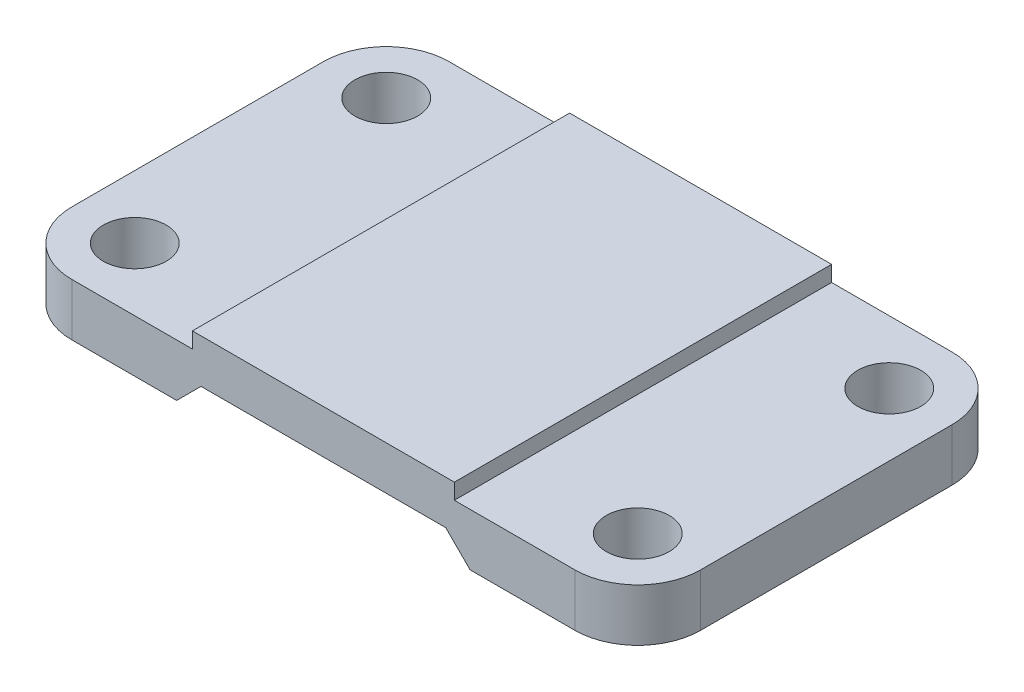
ISO-10303-21;
HEADER;
FILE_DESCRIPTION(('STEP AP214'),'2;1');
FILE_NAME('part.step','',(''),(''),'','','');
FILE_SCHEMA(('AUTOMOTIVE_DESIGN { 1 0 10303 214 1 1 1 1 }'));
ENDSEC;
DATA;
#1=APPLICATION_CONTEXT('core data for automotive mechanical design processes');
#2=APPLICATION_PROTOCOL_DEFINITION('international standard','automotive_design',2000,#1);
#3=PRODUCT_CONTEXT('',#1,'mechanical');
#4=PRODUCT('Part','Part','',(#3));
#5=PRODUCT_RELATED_PRODUCT_CATEGORY('part','',(#4));
#6=PRODUCT_DEFINITION_FORMATION('','',#4);
#7=PRODUCT_DEFINITION_CONTEXT('part definition',#1,'design');
#8=PRODUCT_DEFINITION('design','',#6,#7);
#9=PRODUCT_DEFINITION_SHAPE('','',#8);
#10=(LENGTH_UNIT() NAMED_UNIT(*) SI_UNIT(.MILLI.,.METRE.));
#11=(NAMED_UNIT(*) PLANE_ANGLE_UNIT() SI_UNIT($,.RADIAN.));
#12=(NAMED_UNIT(*) SI_UNIT($,.STERADIAN.) SOLID_ANGLE_UNIT());
#13=UNCERTAINTY_MEASURE_WITH_UNIT(LENGTH_MEASURE(1.E-05),#10,'distance_accuracy_value','');
#14=(GEOMETRIC_REPRESENTATION_CONTEXT(3) GLOBAL_UNCERTAINTY_ASSIGNED_CONTEXT((#13)) GLOBAL_UNIT_ASSIGNED_CONTEXT((#10,
#11,#12)) REPRESENTATION_CONTEXT('',''));
#15=CARTESIAN_POINT('',(0.,0.,0.));
#16=DIRECTION('',(0.,0.,1.));
#17=DIRECTION('',(1.,0.,0.));
#18=AXIS2_PLACEMENT_3D('',#15,#16,#17);
#19=CARTESIAN_POINT('',(32.,0.,72.));
#20=DIRECTION('',(0.,1.,0.));
#21=DIRECTION('',(-1.,0.,0.));
#22=AXIS2_PLACEMENT_3D('',#19,#20,#21);
#23=PLANE('',#22);
#24=CARTESIAN_POINT('',(12.,0.,60.));
#25=DIRECTION('',(0.,1.,0.));
#26=DIRECTION('',(-1.,0.,0.));
#27=AXIS2_PLACEMENT_3D('',#24,#25,#26);
#28=CIRCLE('',#27,6.);
#29=CARTESIAN_POINT('',(6.,0.,60.));
#30=VERTEX_POINT('',#29);
#31=EDGE_CURVE('E335',#30,#30,#28,.T.);
#32=ORIENTED_EDGE('',*,*,#31,.T.);
#33=EDGE_LOOP('',(#32));
#34=FACE_BOUND('',#33,.T.);
#35=CARTESIAN_POINT('',(12.,0.,12.));
#36=DIRECTION('',(0.,1.,0.));
#37=DIRECTION('',(-1.,0.,0.));
#38=AXIS2_PLACEMENT_3D('',#35,#36,#37);
#39=CIRCLE('',#38,6.);
#40=CARTESIAN_POINT('',(6.,0.,12.));
#41=VERTEX_POINT('',#40);
#42=EDGE_CURVE('E327',#41,#41,#39,.T.);
#43=ORIENTED_EDGE('',*,*,#42,.T.);
#44=EDGE_LOOP('',(#43));
#45=FACE_BOUND('',#44,.T.);
#46=CARTESIAN_POINT('',(12.,0.,12.));
#47=DIRECTION('',(0.,1.,0.));
#48=DIRECTION('',(-1.,0.,0.));
#49=AXIS2_PLACEMENT_3D('',#46,#47,#48);
#50=CIRCLE('',#49,12.);
#51=CARTESIAN_POINT('',(12.0000000000001,0.,0.));
#52=VERTEX_POINT('',#51);
#53=CARTESIAN_POINT('',(0.,0.,12.0000000000001));
#54=VERTEX_POINT('',#53);
#55=EDGE_CURVE('E325',#52,#54,#50,.T.);
#56=ORIENTED_EDGE('',*,*,#55,.F.);
#57=DIRECTION('',(1.,0.,0.));
#58=VECTOR('',#57,1.);
#59=CARTESIAN_POINT('',(32.,0.,0.));
#60=LINE('',#59,#58);
#61=CARTESIAN_POINT('',(32.,0.,0.));
#62=VERTEX_POINT('',#61);
#63=EDGE_CURVE('E279',#52,#62,#60,.T.);
#64=ORIENTED_EDGE('',*,*,#63,.T.);
#65=DIRECTION('',(0.,0.,-1.));
#66=VECTOR('',#65,1.);
#67=CARTESIAN_POINT('',(32.,0.,72.));
#68=LINE('',#67,#66);
#69=CARTESIAN_POINT('',(32.,0.,72.));
#70=VERTEX_POINT('',#69);
#71=EDGE_CURVE('E245',#70,#62,#68,.T.);
#72=ORIENTED_EDGE('',*,*,#71,.F.);
#73=DIRECTION('',(1.,0.,0.));
#74=VECTOR('',#73,1.);
#75=CARTESIAN_POINT('',(32.,0.,72.));
#76=LINE('',#75,#74);
#77=CARTESIAN_POINT('',(12.,0.,72.));
#78=VERTEX_POINT('',#77);
#79=EDGE_CURVE('E299',#78,#70,#76,.T.);
#80=ORIENTED_EDGE('',*,*,#79,.F.);
#81=CARTESIAN_POINT('',(12.,0.,60.));
#82=DIRECTION('',(0.,1.,0.));
#83=DIRECTION('',(-1.,0.,0.));
#84=AXIS2_PLACEMENT_3D('',#81,#82,#83);
#85=CIRCLE('',#84,12.);
#86=CARTESIAN_POINT('',(0.,0.,59.9999999999999));
#87=VERTEX_POINT('',#86);
#88=EDGE_CURVE('E102',#87,#78,#85,.T.);
#89=ORIENTED_EDGE('',*,*,#88,.F.);
#90=DIRECTION('',(0.,0.,-1.));
#91=VECTOR('',#90,1.);
#92=CARTESIAN_POINT('',(0.,0.,72.));
#93=LINE('',#92,#91);
#94=EDGE_CURVE('E207',#87,#54,#93,.T.);
#95=ORIENTED_EDGE('',*,*,#94,.T.);
#96=EDGE_LOOP('',(#56,#64,#72,#80,#89,#95));
#97=FACE_BOUND('',#96,.T.);
#98=ADVANCED_FACE('F81',(#34,#45,#97),#23,.F.);
#99=CARTESIAN_POINT('',(120.,0.,72.));
#100=DIRECTION('',(0.,1.,0.));
#101=DIRECTION('',(-1.,0.,0.));
#102=AXIS2_PLACEMENT_3D('',#99,#100,#101);
#103=PLANE('',#102);
#104=CARTESIAN_POINT('',(108.,0.,60.));
#105=DIRECTION('',(0.,1.,0.));
#106=DIRECTION('',(-1.,0.,0.));
#107=AXIS2_PLACEMENT_3D('',#104,#105,#106);
#108=CIRCLE('',#107,6.);
#109=CARTESIAN_POINT('',(102.,0.,60.));
#110=VERTEX_POINT('',#109);
#111=EDGE_CURVE('E337',#110,#110,#108,.T.);
#112=ORIENTED_EDGE('',*,*,#111,.T.);
#113=EDGE_LOOP('',(#112));
#114=FACE_BOUND('',#113,.T.);
#115=CARTESIAN_POINT('',(108.,0.,60.));
#116=DIRECTION('',(0.,1.,0.));
#117=DIRECTION('',(-1.,0.,0.));
#118=AXIS2_PLACEMENT_3D('',#115,#116,#117);
#119=CIRCLE('',#118,12.);
#120=CARTESIAN_POINT('',(108.,0.,72.));
#121=VERTEX_POINT('',#120);
#122=CARTESIAN_POINT('',(120.,0.,59.9999999999999));
#123=VERTEX_POINT('',#122);
#124=EDGE_CURVE('E322',#121,#123,#119,.T.);
#125=ORIENTED_EDGE('',*,*,#124,.F.);
#126=DIRECTION('',(1.,0.,0.));
#127=VECTOR('',#126,1.);
#128=CARTESIAN_POINT('',(120.,0.,72.));
#129=LINE('',#128,#127);
#130=CARTESIAN_POINT('',(88.,0.,72.));
#131=VERTEX_POINT('',#130);
#132=EDGE_CURVE('E260',#131,#121,#129,.T.);
#133=ORIENTED_EDGE('',*,*,#132,.F.);
#134=DIRECTION('',(0.,0.,-1.));
#135=VECTOR('',#134,1.);
#136=CARTESIAN_POINT('',(88.,0.,72.));
#137=LINE('',#136,#135);
#138=CARTESIAN_POINT('',(88.,0.,0.));
#139=VERTEX_POINT('',#138);
#140=EDGE_CURVE('E236',#131,#139,#137,.T.);
#141=ORIENTED_EDGE('',*,*,#140,.T.);
#142=DIRECTION('',(1.,0.,0.));
#143=VECTOR('',#142,1.);
#144=CARTESIAN_POINT('',(120.,0.,0.));
#145=LINE('',#144,#143);
#146=CARTESIAN_POINT('',(108.,0.,0.));
#147=VERTEX_POINT('',#146);
#148=EDGE_CURVE('E288',#139,#147,#145,.T.);
#149=ORIENTED_EDGE('',*,*,#148,.T.);
#150=CARTESIAN_POINT('',(108.,0.,12.));
#151=DIRECTION('',(0.,1.,0.));
#152=DIRECTION('',(-1.,0.,0.));
#153=AXIS2_PLACEMENT_3D('',#150,#151,#152);
#154=CIRCLE('',#153,12.);
#155=CARTESIAN_POINT('',(120.,0.,12.0000000000001));
#156=VERTEX_POINT('',#155);
#157=EDGE_CURVE('E329',#147,#156,#154,.F.);
#158=ORIENTED_EDGE('',*,*,#157,.T.);
#159=DIRECTION('',(0.,0.,-1.));
#160=VECTOR('',#159,1.);
#161=CARTESIAN_POINT('',(120.,0.,72.));
#162=LINE('',#161,#160);
#163=EDGE_CURVE('E233',#123,#156,#162,.T.);
#164=ORIENTED_EDGE('',*,*,#163,.F.);
#165=EDGE_LOOP('',(#125,#133,#141,#149,#158,#164));
#166=FACE_BOUND('',#165,.T.);
#167=CARTESIAN_POINT('',(108.,0.,12.));
#168=DIRECTION('',(0.,1.,0.));
#169=DIRECTION('',(-1.,0.,0.));
#170=AXIS2_PLACEMENT_3D('',#167,#168,#169);
#171=CIRCLE('',#170,6.);
#172=CARTESIAN_POINT('',(102.,0.,12.));
#173=VERTEX_POINT('',#172);
#174=EDGE_CURVE('E282',#173,#173,#171,.T.);
#175=ORIENTED_EDGE('',*,*,#174,.T.);
#176=EDGE_LOOP('',(#175));
#177=FACE_BOUND('',#176,.T.);
#178=ADVANCED_FACE('F319',(#114,#166,#177),#103,.F.);
#179=CARTESIAN_POINT('',(120.,10.,72.));
#180=DIRECTION('',(-1.,0.,0.));
#181=DIRECTION('',(0.,0.,1.));
#182=AXIS2_PLACEMENT_3D('',#179,#180,#181);
#183=PLANE('',#182);
#184=DIRECTION('',(0.,1.,0.));
#185=VECTOR('',#184,1.);
#186=CARTESIAN_POINT('',(120.,-62.,59.9999999999999));
#187=LINE('',#186,#185);
#188=CARTESIAN_POINT('',(120.,10.,59.9999999999999));
#189=VERTEX_POINT('',#188);
#190=EDGE_CURVE('E198',#123,#189,#187,.T.);
#191=ORIENTED_EDGE('',*,*,#190,.F.);
#192=ORIENTED_EDGE('',*,*,#163,.T.);
#193=DIRECTION('',(0.,1.,0.));
#194=VECTOR('',#193,1.);
#195=CARTESIAN_POINT('',(120.,-62.,12.0000000000001));
#196=LINE('',#195,#194);
#197=CARTESIAN_POINT('',(120.,10.,12.0000000000001));
#198=VERTEX_POINT('',#197);
#199=EDGE_CURVE('E386',#156,#198,#196,.T.);
#200=ORIENTED_EDGE('',*,*,#199,.T.);
#201=DIRECTION('',(0.,0.,-1.));
#202=VECTOR('',#201,1.);
#203=CARTESIAN_POINT('',(120.,10.,72.));
#204=LINE('',#203,#202);
#205=EDGE_CURVE('E230',#189,#198,#204,.T.);
#206=ORIENTED_EDGE('',*,*,#205,.F.);
#207=EDGE_LOOP('',(#191,#192,#200,#206));
#208=FACE_BOUND('',#207,.T.);
#209=ADVANCED_FACE('F362',(#208),#183,.F.);
#210=CARTESIAN_POINT('',(85.,10.,72.));
#211=DIRECTION('',(0.,-1.,0.));
#212=DIRECTION('',(1.,0.,0.));
#213=AXIS2_PLACEMENT_3D('',#210,#211,#212);
#214=PLANE('',#213);
#215=CARTESIAN_POINT('',(108.,10.,60.));
#216=DIRECTION('',(0.,1.,0.));
#217=DIRECTION('',(0.,0.,1.));
#218=AXIS2_PLACEMENT_3D('',#215,#216,#217);
#219=CIRCLE('',#218,6.);
#220=CARTESIAN_POINT('',(108.,10.,66.));
#221=VERTEX_POINT('',#220);
#222=EDGE_CURVE('E395',#221,#221,#219,.T.);
#223=ORIENTED_EDGE('',*,*,#222,.F.);
#224=EDGE_LOOP('',(#223));
#225=FACE_BOUND('',#224,.T.);
#226=CARTESIAN_POINT('',(108.,10.,60.));
#227=DIRECTION('',(0.,1.,0.));
#228=DIRECTION('',(0.,0.,1.));
#229=AXIS2_PLACEMENT_3D('',#226,#227,#228);
#230=CIRCLE('',#229,12.);
#231=CARTESIAN_POINT('',(108.,10.,72.));
#232=VERTEX_POINT('',#231);
#233=EDGE_CURVE('E95',#232,#189,#230,.T.);
#234=ORIENTED_EDGE('',*,*,#233,.T.);
#235=ORIENTED_EDGE('',*,*,#205,.T.);
#236=CARTESIAN_POINT('',(108.,10.,12.));
#237=DIRECTION('',(0.,1.,0.));
#238=DIRECTION('',(0.,0.,1.));
#239=AXIS2_PLACEMENT_3D('',#236,#237,#238);
#240=CIRCLE('',#239,12.);
#241=CARTESIAN_POINT('',(108.,10.,0.));
#242=VERTEX_POINT('',#241);
#243=EDGE_CURVE('E390',#242,#198,#240,.F.);
#244=ORIENTED_EDGE('',*,*,#243,.F.);
#245=DIRECTION('',(-1.,0.,0.));
#246=VECTOR('',#245,1.);
#247=CARTESIAN_POINT('',(85.,10.,0.));
#248=LINE('',#247,#246);
#249=CARTESIAN_POINT('',(85.,10.,0.));
#250=VERTEX_POINT('',#249);
#251=EDGE_CURVE('E291',#242,#250,#248,.T.);
#252=ORIENTED_EDGE('',*,*,#251,.T.);
#253=DIRECTION('',(0.,0.,-1.));
#254=VECTOR('',#253,1.);
#255=CARTESIAN_POINT('',(85.,10.,72.));
#256=LINE('',#255,#254);
#257=CARTESIAN_POINT('',(85.,10.,72.));
#258=VERTEX_POINT('',#257);
#259=EDGE_CURVE('E227',#258,#250,#256,.T.);
#260=ORIENTED_EDGE('',*,*,#259,.F.);
#261=DIRECTION('',(-1.,0.,0.));
#262=VECTOR('',#261,1.);
#263=CARTESIAN_POINT('',(85.,10.,72.));
#264=LINE('',#263,#262);
#265=EDGE_CURVE('E257',#232,#258,#264,.T.);
#266=ORIENTED_EDGE('',*,*,#265,.F.);
#267=EDGE_LOOP('',(#234,#235,#244,#252,#260,#266));
#268=FACE_BOUND('',#267,.T.);
#269=CARTESIAN_POINT('',(108.,10.,12.));
#270=DIRECTION('',(0.,1.,0.));
#271=DIRECTION('',(0.,0.,1.));
#272=AXIS2_PLACEMENT_3D('',#269,#270,#271);
#273=CIRCLE('',#272,6.);
#274=CARTESIAN_POINT('',(108.,10.,18.));
#275=VERTEX_POINT('',#274);
#276=EDGE_CURVE('E393',#275,#275,#273,.T.);
#277=ORIENTED_EDGE('',*,*,#276,.F.);
#278=EDGE_LOOP('',(#277));
#279=FACE_BOUND('',#278,.T.);
#280=ADVANCED_FACE('F263',(#225,#268,#279),#214,.F.);
#281=CARTESIAN_POINT('',(0.,10.,72.));
#282=DIRECTION('',(0.,-1.,0.));
#283=DIRECTION('',(0.,0.,-1.));
#284=AXIS2_PLACEMENT_3D('',#281,#282,#283);
#285=PLANE('',#284);
#286=CARTESIAN_POINT('',(12.,10.,60.));
#287=DIRECTION('',(0.,1.,0.));
#288=DIRECTION('',(0.,0.,1.));
#289=AXIS2_PLACEMENT_3D('',#286,#287,#288);
#290=CIRCLE('',#289,6.);
#291=CARTESIAN_POINT('',(12.,10.,66.));
#292=VERTEX_POINT('',#291);
#293=EDGE_CURVE('E398',#292,#292,#290,.T.);
#294=ORIENTED_EDGE('',*,*,#293,.F.);
#295=EDGE_LOOP('',(#294));
#296=FACE_BOUND('',#295,.T.);
#297=CARTESIAN_POINT('',(12.,10.,12.));
#298=DIRECTION('',(0.,1.,0.));
#299=DIRECTION('',(0.,0.,1.));
#300=AXIS2_PLACEMENT_3D('',#297,#298,#299);
#301=CIRCLE('',#300,6.);
#302=CARTESIAN_POINT('',(12.,10.,18.));
#303=VERTEX_POINT('',#302);
#304=EDGE_CURVE('E383',#303,#303,#301,.T.);
#305=ORIENTED_EDGE('',*,*,#304,.F.);
#306=EDGE_LOOP('',(#305));
#307=FACE_BOUND('',#306,.T.);
#308=CARTESIAN_POINT('',(12.,10.,12.));
#309=DIRECTION('',(0.,1.,0.));
#310=DIRECTION('',(0.,0.,1.));
#311=AXIS2_PLACEMENT_3D('',#308,#309,#310);
#312=CIRCLE('',#311,12.);
#313=CARTESIAN_POINT('',(12.0000000000001,10.,0.));
#314=VERTEX_POINT('',#313);
#315=CARTESIAN_POINT('',(0.,10.,12.0000000000001));
#316=VERTEX_POINT('',#315);
#317=EDGE_CURVE('E208',#314,#316,#312,.T.);
#318=ORIENTED_EDGE('',*,*,#317,.T.);
#319=DIRECTION('',(0.,0.,-1.));
#320=VECTOR('',#319,1.);
#321=CARTESIAN_POINT('',(0.,10.,72.));
#322=LINE('',#321,#320);
#323=CARTESIAN_POINT('',(0.,10.,59.9999999999999));
#324=VERTEX_POINT('',#323);
#325=EDGE_CURVE('E205',#324,#316,#322,.T.);
#326=ORIENTED_EDGE('',*,*,#325,.F.);
#327=CARTESIAN_POINT('',(12.,10.,60.));
#328=DIRECTION('',(0.,1.,0.));
#329=DIRECTION('',(0.,0.,1.));
#330=AXIS2_PLACEMENT_3D('',#327,#328,#329);
#331=CIRCLE('',#330,12.);
#332=CARTESIAN_POINT('',(12.0000000000001,10.,72.));
#333=VERTEX_POINT('',#332);
#334=EDGE_CURVE('E190',#324,#333,#331,.T.);
#335=ORIENTED_EDGE('',*,*,#334,.T.);
#336=DIRECTION('',(-1.,0.,0.));
#337=VECTOR('',#336,1.);
#338=CARTESIAN_POINT('',(0.,10.,72.));
#339=LINE('',#338,#337);
#340=CARTESIAN_POINT('',(35.,10.,72.));
#341=VERTEX_POINT('',#340);
#342=EDGE_CURVE('E218',#341,#333,#339,.T.);
#343=ORIENTED_EDGE('',*,*,#342,.F.);
#344=DIRECTION('',(0.,0.,-1.));
#345=VECTOR('',#344,1.);
#346=CARTESIAN_POINT('',(35.,10.,72.));
#347=LINE('',#346,#345);
#348=CARTESIAN_POINT('',(35.,10.,0.));
#349=VERTEX_POINT('',#348);
#350=EDGE_CURVE('E213',#341,#349,#347,.T.);
#351=ORIENTED_EDGE('',*,*,#350,.T.);
#352=DIRECTION('',(-1.,0.,0.));
#353=VECTOR('',#352,1.);
#354=CARTESIAN_POINT('',(0.,10.,0.));
#355=LINE('',#354,#353);
#356=EDGE_CURVE('E298',#349,#314,#355,.T.);
#357=ORIENTED_EDGE('',*,*,#356,.T.);
#358=EDGE_LOOP('',(#318,#326,#335,#343,#351,#357));
#359=FACE_BOUND('',#358,.T.);
#360=ADVANCED_FACE('F211',(#296,#307,#359),#285,.F.);
#361=CARTESIAN_POINT('',(0.,0.,72.));
#362=DIRECTION('',(1.,0.,0.));
#363=DIRECTION('',(0.,0.,-1.));
#364=AXIS2_PLACEMENT_3D('',#361,#362,#363);
#365=PLANE('',#364);
#366=DIRECTION('',(0.,1.,0.));
#367=VECTOR('',#366,1.);
#368=CARTESIAN_POINT('',(0.,-62.,12.0000000000001));
#369=LINE('',#368,#367);
#370=EDGE_CURVE('E401',#54,#316,#369,.T.);
#371=ORIENTED_EDGE('',*,*,#370,.F.);
#372=ORIENTED_EDGE('',*,*,#94,.F.);
#373=DIRECTION('',(0.,1.,0.));
#374=VECTOR('',#373,1.);
#375=CARTESIAN_POINT('',(0.,-62.,59.9999999999999));
#376=LINE('',#375,#374);
#377=EDGE_CURVE('E193',#87,#324,#376,.T.);
#378=ORIENTED_EDGE('',*,*,#377,.T.);
#379=ORIENTED_EDGE('',*,*,#325,.T.);
#380=EDGE_LOOP('',(#371,#372,#378,#379));
#381=FACE_BOUND('',#380,.T.);
#382=ADVANCED_FACE('F204',(#381),#365,.F.);
#383=CARTESIAN_POINT('',(0.,0.,72.));
#384=DIRECTION('',(0.,0.,-1.));
#385=DIRECTION('',(-1.,0.,0.));
#386=AXIS2_PLACEMENT_3D('',#383,#384,#385);
#387=PLANE('',#386);
#388=DIRECTION('',(0.,1.,0.));
#389=VECTOR('',#388,1.);
#390=CARTESIAN_POINT('',(12.,-62.,72.));
#391=LINE('',#390,#389);
#392=EDGE_CURVE('E12',#78,#333,#391,.T.);
#393=ORIENTED_EDGE('',*,*,#392,.F.);
#394=ORIENTED_EDGE('',*,*,#79,.T.);
#395=DIRECTION('',(0.707106781186547,0.707106781186548,0.));
#396=VECTOR('',#395,1.);
#397=CARTESIAN_POINT('',(36.6508305535048,4.65083055350479,72.));
#398=LINE('',#397,#396);
#399=CARTESIAN_POINT('',(36.6508305535048,4.65083055350479,72.));
#400=VERTEX_POINT('',#399);
#401=EDGE_CURVE('E301',#70,#400,#398,.T.);
#402=ORIENTED_EDGE('',*,*,#401,.T.);
#403=DIRECTION('',(1.,0.,0.));
#404=VECTOR('',#403,1.);
#405=CARTESIAN_POINT('',(83.3491694464952,4.6508305535048,72.));
#406=LINE('',#405,#404);
#407=CARTESIAN_POINT('',(83.3491694464952,4.6508305535048,72.));
#408=VERTEX_POINT('',#407);
#409=EDGE_CURVE('E305',#400,#408,#406,.T.);
#410=ORIENTED_EDGE('',*,*,#409,.T.);
#411=DIRECTION('',(0.707106781186552,-0.707106781186543,0.));
#412=VECTOR('',#411,1.);
#413=CARTESIAN_POINT('',(83.3491694464952,4.6508305535048,72.));
#414=LINE('',#413,#412);
#415=EDGE_CURVE('E271',#408,#131,#414,.T.);
#416=ORIENTED_EDGE('',*,*,#415,.T.);
#417=ORIENTED_EDGE('',*,*,#132,.T.);
#418=DIRECTION('',(0.,1.,0.));
#419=VECTOR('',#418,1.);
#420=CARTESIAN_POINT('',(108.,-62.,72.));
#421=LINE('',#420,#419);
#422=EDGE_CURVE('E88',#121,#232,#421,.T.);
#423=ORIENTED_EDGE('',*,*,#422,.T.);
#424=ORIENTED_EDGE('',*,*,#265,.T.);
#425=DIRECTION('',(0.,1.,0.));
#426=VECTOR('',#425,1.);
#427=CARTESIAN_POINT('',(85.,13.,72.));
#428=LINE('',#427,#426);
#429=CARTESIAN_POINT('',(85.,13.,72.));
#430=VERTEX_POINT('',#429);
#431=EDGE_CURVE('E267',#258,#430,#428,.T.);
#432=ORIENTED_EDGE('',*,*,#431,.T.);
#433=DIRECTION('',(-1.,0.,0.));
#434=VECTOR('',#433,1.);
#435=CARTESIAN_POINT('',(35.,13.,72.));
#436=LINE('',#435,#434);
#437=CARTESIAN_POINT('',(35.,13.,72.));
#438=VERTEX_POINT('',#437);
#439=EDGE_CURVE('E269',#430,#438,#436,.T.);
#440=ORIENTED_EDGE('',*,*,#439,.T.);
#441=DIRECTION('',(0.,-1.,0.));
#442=VECTOR('',#441,1.);
#443=CARTESIAN_POINT('',(35.,10.,72.));
#444=LINE('',#443,#442);
#445=EDGE_CURVE('E276',#438,#341,#444,.T.);
#446=ORIENTED_EDGE('',*,*,#445,.T.);
#447=ORIENTED_EDGE('',*,*,#342,.T.);
#448=EDGE_LOOP('',(#393,#394,#402,#410,#416,#417,#423,#424,#432,#440,#446,#447));
#449=FACE_BOUND('',#448,.T.);
#450=ADVANCED_FACE('F256',(#449),#387,.F.);
#451=CARTESIAN_POINT('',(0.,0.,0.));
#452=DIRECTION('',(0.,0.,-1.));
#453=DIRECTION('',(-1.,0.,0.));
#454=AXIS2_PLACEMENT_3D('',#451,#452,#453);
#455=PLANE('',#454);
#456=ORIENTED_EDGE('',*,*,#63,.F.);
#457=DIRECTION('',(0.,1.,0.));
#458=VECTOR('',#457,1.);
#459=CARTESIAN_POINT('',(12.,-62.,0.));
#460=LINE('',#459,#458);
#461=EDGE_CURVE('E251',#52,#314,#460,.T.);
#462=ORIENTED_EDGE('',*,*,#461,.T.);
#463=ORIENTED_EDGE('',*,*,#356,.F.);
#464=DIRECTION('',(0.,-1.,0.));
#465=VECTOR('',#464,1.);
#466=CARTESIAN_POINT('',(35.,10.,0.));
#467=LINE('',#466,#465);
#468=CARTESIAN_POINT('',(35.,13.,0.));
#469=VERTEX_POINT('',#468);
#470=EDGE_CURVE('E297',#469,#349,#467,.T.);
#471=ORIENTED_EDGE('',*,*,#470,.F.);
#472=DIRECTION('',(-1.,0.,0.));
#473=VECTOR('',#472,1.);
#474=CARTESIAN_POINT('',(35.,13.,0.));
#475=LINE('',#474,#473);
#476=CARTESIAN_POINT('',(85.,13.,0.));
#477=VERTEX_POINT('',#476);
#478=EDGE_CURVE('E295',#477,#469,#475,.T.);
#479=ORIENTED_EDGE('',*,*,#478,.F.);
#480=DIRECTION('',(0.,1.,0.));
#481=VECTOR('',#480,1.);
#482=CARTESIAN_POINT('',(85.,13.,0.));
#483=LINE('',#482,#481);
#484=EDGE_CURVE('E293',#250,#477,#483,.T.);
#485=ORIENTED_EDGE('',*,*,#484,.F.);
#486=ORIENTED_EDGE('',*,*,#251,.F.);
#487=DIRECTION('',(0.,1.,0.));
#488=VECTOR('',#487,1.);
#489=CARTESIAN_POINT('',(108.,-62.,0.));
#490=LINE('',#489,#488);
#491=EDGE_CURVE('E248',#242,#147,#490,.F.);
#492=ORIENTED_EDGE('',*,*,#491,.T.);
#493=ORIENTED_EDGE('',*,*,#148,.F.);
#494=DIRECTION('',(0.707106781186552,-0.707106781186543,0.));
#495=VECTOR('',#494,1.);
#496=CARTESIAN_POINT('',(83.3491694464952,4.6508305535048,0.));
#497=LINE('',#496,#495);
#498=CARTESIAN_POINT('',(83.3491694464952,4.6508305535048,0.));
#499=VERTEX_POINT('',#498);
#500=EDGE_CURVE('E286',#499,#139,#497,.T.);
#501=ORIENTED_EDGE('',*,*,#500,.F.);
#502=DIRECTION('',(1.,0.,0.));
#503=VECTOR('',#502,1.);
#504=CARTESIAN_POINT('',(83.3491694464952,4.6508305535048,0.));
#505=LINE('',#504,#503);
#506=CARTESIAN_POINT('',(36.6508305535048,4.65083055350479,0.));
#507=VERTEX_POINT('',#506);
#508=EDGE_CURVE('E284',#507,#499,#505,.T.);
#509=ORIENTED_EDGE('',*,*,#508,.F.);
#510=DIRECTION('',(0.707106781186547,0.707106781186548,0.));
#511=VECTOR('',#510,1.);
#512=CARTESIAN_POINT('',(36.6508305535048,4.65083055350479,0.));
#513=LINE('',#512,#511);
#514=EDGE_CURVE('E281',#62,#507,#513,.T.);
#515=ORIENTED_EDGE('',*,*,#514,.F.);
#516=EDGE_LOOP('',(#456,#462,#463,#471,#479,#485,#486,#492,#493,#501,#509,#515));
#517=FACE_BOUND('',#516,.T.);
#518=ADVANCED_FACE('F374',(#517),#455,.T.);
#519=CARTESIAN_POINT('',(36.6508305535048,4.65083055350479,72.));
#520=DIRECTION('',(-0.707106781186548,0.707106781186547,0.));
#521=DIRECTION('',(-0.707106781186547,-0.707106781186548,0.));
#522=AXIS2_PLACEMENT_3D('',#519,#520,#521);
#523=PLANE('',#522);
#524=ORIENTED_EDGE('',*,*,#514,.T.);
#525=DIRECTION('',(0.,0.,-1.));
#526=VECTOR('',#525,1.);
#527=CARTESIAN_POINT('',(36.6508305535048,4.65083055350479,72.));
#528=LINE('',#527,#526);
#529=EDGE_CURVE('E242',#400,#507,#528,.T.);
#530=ORIENTED_EDGE('',*,*,#529,.F.);
#531=ORIENTED_EDGE('',*,*,#401,.F.);
#532=ORIENTED_EDGE('',*,*,#71,.T.);
#533=EDGE_LOOP('',(#524,#530,#531,#532));
#534=FACE_BOUND('',#533,.T.);
#535=ADVANCED_FACE('F378',(#534),#523,.F.);
#536=CARTESIAN_POINT('',(83.3491694464952,4.6508305535048,72.));
#537=DIRECTION('',(0.,1.,0.));
#538=DIRECTION('',(-1.,0.,0.));
#539=AXIS2_PLACEMENT_3D('',#536,#537,#538);
#540=PLANE('',#539);
#541=ORIENTED_EDGE('',*,*,#508,.T.);
#542=DIRECTION('',(0.,0.,-1.));
#543=VECTOR('',#542,1.);
#544=CARTESIAN_POINT('',(83.3491694464952,4.6508305535048,72.));
#545=LINE('',#544,#543);
#546=EDGE_CURVE('E239',#408,#499,#545,.T.);
#547=ORIENTED_EDGE('',*,*,#546,.F.);
#548=ORIENTED_EDGE('',*,*,#409,.F.);
#549=ORIENTED_EDGE('',*,*,#529,.T.);
#550=EDGE_LOOP('',(#541,#547,#548,#549));
#551=FACE_BOUND('',#550,.T.);
#552=ADVANCED_FACE('F380',(#551),#540,.F.);
#553=CARTESIAN_POINT('',(83.3491694464952,4.6508305535048,72.));
#554=DIRECTION('',(0.707106781186543,0.707106781186552,0.));
#555=DIRECTION('',(-0.707106781186552,0.707106781186543,0.));
#556=AXIS2_PLACEMENT_3D('',#553,#554,#555);
#557=PLANE('',#556);
#558=ORIENTED_EDGE('',*,*,#500,.T.);
#559=ORIENTED_EDGE('',*,*,#140,.F.);
#560=ORIENTED_EDGE('',*,*,#415,.F.);
#561=ORIENTED_EDGE('',*,*,#546,.T.);
#562=EDGE_LOOP('',(#558,#559,#560,#561));
#563=FACE_BOUND('',#562,.T.);
#564=ADVANCED_FACE('F315',(#563),#557,.F.);
#565=CARTESIAN_POINT('',(85.,13.,72.));
#566=DIRECTION('',(-1.,0.,0.));
#567=DIRECTION('',(0.,0.,1.));
#568=AXIS2_PLACEMENT_3D('',#565,#566,#567);
#569=PLANE('',#568);
#570=ORIENTED_EDGE('',*,*,#484,.T.);
#571=DIRECTION('',(0.,0.,-1.));
#572=VECTOR('',#571,1.);
#573=CARTESIAN_POINT('',(85.,13.,72.));
#574=LINE('',#573,#572);
#575=EDGE_CURVE('E224',#430,#477,#574,.T.);
#576=ORIENTED_EDGE('',*,*,#575,.F.);
#577=ORIENTED_EDGE('',*,*,#431,.F.);
#578=ORIENTED_EDGE('',*,*,#259,.T.);
#579=EDGE_LOOP('',(#570,#576,#577,#578));
#580=FACE_BOUND('',#579,.T.);
#581=ADVANCED_FACE('F431',(#580),#569,.F.);
#582=CARTESIAN_POINT('',(35.,13.,72.));
#583=DIRECTION('',(0.,-1.,0.));
#584=DIRECTION('',(0.,0.,-1.));
#585=AXIS2_PLACEMENT_3D('',#582,#583,#584);
#586=PLANE('',#585);
#587=ORIENTED_EDGE('',*,*,#478,.T.);
#588=DIRECTION('',(0.,0.,-1.));
#589=VECTOR('',#588,1.);
#590=CARTESIAN_POINT('',(35.,13.,72.));
#591=LINE('',#590,#589);
#592=EDGE_CURVE('E216',#438,#469,#591,.T.);
#593=ORIENTED_EDGE('',*,*,#592,.F.);
#594=ORIENTED_EDGE('',*,*,#439,.F.);
#595=ORIENTED_EDGE('',*,*,#575,.T.);
#596=EDGE_LOOP('',(#587,#593,#594,#595));
#597=FACE_BOUND('',#596,.T.);
#598=ADVANCED_FACE('F427',(#597),#586,.F.);
#599=CARTESIAN_POINT('',(35.,10.,72.));
#600=DIRECTION('',(1.,0.,0.));
#601=DIRECTION('',(0.,0.,-1.));
#602=AXIS2_PLACEMENT_3D('',#599,#600,#601);
#603=PLANE('',#602);
#604=ORIENTED_EDGE('',*,*,#470,.T.);
#605=ORIENTED_EDGE('',*,*,#350,.F.);
#606=ORIENTED_EDGE('',*,*,#445,.F.);
#607=ORIENTED_EDGE('',*,*,#592,.T.);
#608=EDGE_LOOP('',(#604,#605,#606,#607));
#609=FACE_BOUND('',#608,.T.);
#610=ADVANCED_FACE('F423',(#609),#603,.F.);
#611=CARTESIAN_POINT('',(108.,-62.,12.));
#612=DIRECTION('',(0.,1.,0.));
#613=DIRECTION('',(0.,0.,1.));
#614=AXIS2_PLACEMENT_3D('',#611,#612,#613);
#615=CYLINDRICAL_SURFACE('',#614,12.);
#616=ORIENTED_EDGE('',*,*,#491,.F.);
#617=ORIENTED_EDGE('',*,*,#243,.T.);
#618=ORIENTED_EDGE('',*,*,#199,.F.);
#619=ORIENTED_EDGE('',*,*,#157,.F.);
#620=EDGE_LOOP('',(#616,#617,#618,#619));
#621=FACE_BOUND('',#620,.T.);
#622=ADVANCED_FACE('F426',(#621),#615,.T.);
#623=CARTESIAN_POINT('',(12.,-62.,12.));
#624=DIRECTION('',(0.,1.,0.));
#625=DIRECTION('',(0.,0.,1.));
#626=AXIS2_PLACEMENT_3D('',#623,#624,#625);
#627=CYLINDRICAL_SURFACE('',#626,12.);
#628=ORIENTED_EDGE('',*,*,#55,.T.);
#629=ORIENTED_EDGE('',*,*,#370,.T.);
#630=ORIENTED_EDGE('',*,*,#317,.F.);
#631=ORIENTED_EDGE('',*,*,#461,.F.);
#632=EDGE_LOOP('',(#628,#629,#630,#631));
#633=FACE_BOUND('',#632,.T.);
#634=ADVANCED_FACE('F452',(#633),#627,.T.);
#635=CARTESIAN_POINT('',(108.,-62.,60.));
#636=DIRECTION('',(0.,1.,0.));
#637=DIRECTION('',(0.,0.,1.));
#638=AXIS2_PLACEMENT_3D('',#635,#636,#637);
#639=CYLINDRICAL_SURFACE('',#638,12.);
#640=ORIENTED_EDGE('',*,*,#124,.T.);
#641=ORIENTED_EDGE('',*,*,#190,.T.);
#642=ORIENTED_EDGE('',*,*,#233,.F.);
#643=ORIENTED_EDGE('',*,*,#422,.F.);
#644=EDGE_LOOP('',(#640,#641,#642,#643));
#645=FACE_BOUND('',#644,.T.);
#646=ADVANCED_FACE('F455',(#645),#639,.T.);
#647=CARTESIAN_POINT('',(12.,-62.,60.));
#648=DIRECTION('',(0.,1.,0.));
#649=DIRECTION('',(0.,0.,1.));
#650=AXIS2_PLACEMENT_3D('',#647,#648,#649);
#651=CYLINDRICAL_SURFACE('',#650,12.);
#652=ORIENTED_EDGE('',*,*,#88,.T.);
#653=ORIENTED_EDGE('',*,*,#392,.T.);
#654=ORIENTED_EDGE('',*,*,#334,.F.);
#655=ORIENTED_EDGE('',*,*,#377,.F.);
#656=EDGE_LOOP('',(#652,#653,#654,#655));
#657=FACE_BOUND('',#656,.T.);
#658=ADVANCED_FACE('F192',(#657),#651,.T.);
#659=CARTESIAN_POINT('',(12.,-62.,12.));
#660=DIRECTION('',(0.,1.,0.));
#661=DIRECTION('',(0.,0.,1.));
#662=AXIS2_PLACEMENT_3D('',#659,#660,#661);
#663=CYLINDRICAL_SURFACE('',#662,6.);
#664=ORIENTED_EDGE('',*,*,#304,.T.);
#665=EDGE_LOOP('',(#664));
#666=FACE_BOUND('',#665,.T.);
#667=ORIENTED_EDGE('',*,*,#42,.F.);
#668=EDGE_LOOP('',(#667));
#669=FACE_BOUND('',#668,.T.);
#670=ADVANCED_FACE('F407',(#666,#669),#663,.F.);
#671=CARTESIAN_POINT('',(12.,-62.,60.));
#672=DIRECTION('',(0.,1.,0.));
#673=DIRECTION('',(0.,0.,1.));
#674=AXIS2_PLACEMENT_3D('',#671,#672,#673);
#675=CYLINDRICAL_SURFACE('',#674,6.);
#676=ORIENTED_EDGE('',*,*,#293,.T.);
#677=EDGE_LOOP('',(#676));
#678=FACE_BOUND('',#677,.T.);
#679=ORIENTED_EDGE('',*,*,#31,.F.);
#680=EDGE_LOOP('',(#679));
#681=FACE_BOUND('',#680,.T.);
#682=ADVANCED_FACE('F352',(#678,#681),#675,.F.);
#683=CARTESIAN_POINT('',(108.,-62.,60.));
#684=DIRECTION('',(0.,1.,0.));
#685=DIRECTION('',(0.,0.,1.));
#686=AXIS2_PLACEMENT_3D('',#683,#684,#685);
#687=CYLINDRICAL_SURFACE('',#686,6.);
#688=ORIENTED_EDGE('',*,*,#222,.T.);
#689=EDGE_LOOP('',(#688));
#690=FACE_BOUND('',#689,.T.);
#691=ORIENTED_EDGE('',*,*,#111,.F.);
#692=EDGE_LOOP('',(#691));
#693=FACE_BOUND('',#692,.T.);
#694=ADVANCED_FACE('F346',(#690,#693),#687,.F.);
#695=CARTESIAN_POINT('',(108.,-62.,12.));
#696=DIRECTION('',(0.,1.,0.));
#697=DIRECTION('',(0.,0.,1.));
#698=AXIS2_PLACEMENT_3D('',#695,#696,#697);
#699=CYLINDRICAL_SURFACE('',#698,6.);
#700=ORIENTED_EDGE('',*,*,#276,.T.);
#701=EDGE_LOOP('',(#700));
#702=FACE_BOUND('',#701,.T.);
#703=ORIENTED_EDGE('',*,*,#174,.F.);
#704=EDGE_LOOP('',(#703));
#705=FACE_BOUND('',#704,.T.);
#706=ADVANCED_FACE('F344',(#702,#705),#699,.F.);
#707=CLOSED_SHELL('',(#98,#178,#209,#280,#360,#382,#450,#518,#535,#552,#564,#581,#598,#610,#622,
#634,#646,#658,#670,#682,#694,#706));
#708=MANIFOLD_SOLID_BREP('B2',#707);
#709=ADVANCED_BREP_SHAPE_REPRESENTATION('',(#18,#708),#14);
#710=SHAPE_DEFINITION_REPRESENTATION(#9,#709);
ENDSEC;
END-ISO-10303-21;
